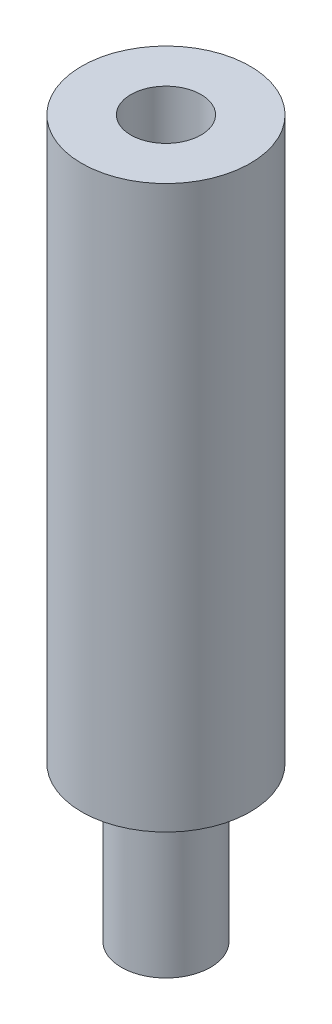
ISO-10303-21;
HEADER;
FILE_DESCRIPTION(('STEP AP214'),'2;1');
FILE_NAME('part.step','',(''),(''),'','','');
FILE_SCHEMA(('AUTOMOTIVE_DESIGN { 1 0 10303 214 1 1 1 1 }'));
ENDSEC;
DATA;
#1=APPLICATION_CONTEXT('core data for automotive mechanical design processes');
#2=APPLICATION_PROTOCOL_DEFINITION('international standard','automotive_design',2000,#1);
#3=PRODUCT_CONTEXT('',#1,'mechanical');
#4=PRODUCT('Part','Part','',(#3));
#5=PRODUCT_RELATED_PRODUCT_CATEGORY('part','',(#4));
#6=PRODUCT_DEFINITION_FORMATION('','',#4);
#7=PRODUCT_DEFINITION_CONTEXT('part definition',#1,'design');
#8=PRODUCT_DEFINITION('design','',#6,#7);
#9=PRODUCT_DEFINITION_SHAPE('','',#8);
#10=(LENGTH_UNIT() NAMED_UNIT(*) SI_UNIT(.MILLI.,.METRE.));
#11=(NAMED_UNIT(*) PLANE_ANGLE_UNIT() SI_UNIT($,.RADIAN.));
#12=(NAMED_UNIT(*) SI_UNIT($,.STERADIAN.) SOLID_ANGLE_UNIT());
#13=UNCERTAINTY_MEASURE_WITH_UNIT(LENGTH_MEASURE(1.E-05),#10,'distance_accuracy_value','');
#14=(GEOMETRIC_REPRESENTATION_CONTEXT(3) GLOBAL_UNCERTAINTY_ASSIGNED_CONTEXT((#13)) GLOBAL_UNIT_ASSIGNED_CONTEXT((#10,
#11,#12)) REPRESENTATION_CONTEXT('',''));
#15=CARTESIAN_POINT('',(0.,0.,0.));
#16=DIRECTION('',(0.,0.,1.));
#17=DIRECTION('',(1.,0.,0.));
#18=AXIS2_PLACEMENT_3D('',#15,#16,#17);
#19=CARTESIAN_POINT('',(0.,5.5,0.));
#20=DIRECTION('',(0.,-1.,0.));
#21=DIRECTION('',(0.,0.,-1.));
#22=AXIS2_PLACEMENT_3D('',#19,#20,#21);
#23=CYLINDRICAL_SURFACE('',#22,0.5);
#24=CARTESIAN_POINT('',(0.,0.,0.));
#25=DIRECTION('',(0.,1.,0.));
#26=DIRECTION('',(0.,0.,1.));
#27=AXIS2_PLACEMENT_3D('',#24,#25,#26);
#28=CIRCLE('',#27,0.5);
#29=CARTESIAN_POINT('',(0.,0.,0.5));
#30=VERTEX_POINT('',#29);
#31=EDGE_CURVE('E40',#30,#30,#28,.T.);
#32=ORIENTED_EDGE('',*,*,#31,.F.);
#33=EDGE_LOOP('',(#32));
#34=FACE_BOUND('',#33,.T.);
#35=CARTESIAN_POINT('',(0.,15.5,0.));
#36=DIRECTION('',(0.,1.,0.));
#37=DIRECTION('',(0.,0.,1.));
#38=AXIS2_PLACEMENT_3D('',#35,#36,#37);
#39=CIRCLE('',#38,0.5);
#40=CARTESIAN_POINT('',(0.,15.5,0.5));
#41=VERTEX_POINT('',#40);
#42=EDGE_CURVE('E36',#41,#41,#39,.T.);
#43=ORIENTED_EDGE('',*,*,#42,.T.);
#44=EDGE_LOOP('',(#43));
#45=FACE_BOUND('',#44,.T.);
#46=ADVANCED_FACE('F32',(#34,#45),#23,.F.);
#47=CARTESIAN_POINT('',(0.,0.,0.));
#48=DIRECTION('',(0.,1.,0.));
#49=DIRECTION('',(0.,0.,1.));
#50=AXIS2_PLACEMENT_3D('',#47,#48,#49);
#51=PLANE('',#50);
#52=CARTESIAN_POINT('',(0.,0.,0.));
#53=DIRECTION('',(0.,1.,0.));
#54=DIRECTION('',(0.,0.,1.));
#55=AXIS2_PLACEMENT_3D('',#52,#53,#54);
#56=CIRCLE('',#55,1.5875);
#57=CARTESIAN_POINT('',(0.,0.,1.5875));
#58=VERTEX_POINT('',#57);
#59=EDGE_CURVE('E10',#58,#58,#56,.T.);
#60=ORIENTED_EDGE('',*,*,#59,.F.);
#61=EDGE_LOOP('',(#60));
#62=FACE_BOUND('',#61,.T.);
#63=ORIENTED_EDGE('',*,*,#31,.T.);
#64=EDGE_LOOP('',(#63));
#65=FACE_BOUND('',#64,.T.);
#66=ADVANCED_FACE('F83',(#62,#65),#51,.F.);
#67=CARTESIAN_POINT('',(0.,5.5,0.));
#68=DIRECTION('',(0.,-1.,0.));
#69=DIRECTION('',(0.,0.,-1.));
#70=AXIS2_PLACEMENT_3D('',#67,#68,#69);
#71=CYLINDRICAL_SURFACE('',#70,1.5875);
#72=CARTESIAN_POINT('',(0.,5.25,0.));
#73=DIRECTION('',(0.,-1.,0.));
#74=DIRECTION('',(0.,0.,-1.));
#75=AXIS2_PLACEMENT_3D('',#72,#73,#74);
#76=CIRCLE('',#75,1.5875);
#77=CARTESIAN_POINT('',(0.,5.25,-1.5875));
#78=VERTEX_POINT('',#77);
#79=EDGE_CURVE('E49',#78,#78,#76,.T.);
#80=ORIENTED_EDGE('',*,*,#79,.T.);
#81=EDGE_LOOP('',(#80));
#82=FACE_BOUND('',#81,.T.);
#83=ORIENTED_EDGE('',*,*,#59,.T.);
#84=EDGE_LOOP('',(#83));
#85=FACE_BOUND('',#84,.T.);
#86=ADVANCED_FACE('F34',(#82,#85),#71,.T.);
#87=CARTESIAN_POINT('',(0.,5.5,0.));
#88=DIRECTION('',(0.,-1.,0.));
#89=DIRECTION('',(0.,0.,-1.));
#90=AXIS2_PLACEMENT_3D('',#87,#88,#89);
#91=CYLINDRICAL_SURFACE('',#90,2.);
#92=CARTESIAN_POINT('',(0.,5.5,0.));
#93=DIRECTION('',(0.,1.,0.));
#94=DIRECTION('',(0.,0.,1.));
#95=AXIS2_PLACEMENT_3D('',#92,#93,#94);
#96=CIRCLE('',#95,2.);
#97=CARTESIAN_POINT('',(0.,5.5,2.));
#98=VERTEX_POINT('',#97);
#99=EDGE_CURVE('E52',#98,#98,#96,.F.);
#100=ORIENTED_EDGE('',*,*,#99,.T.);
#101=EDGE_LOOP('',(#100));
#102=FACE_BOUND('',#101,.T.);
#103=CARTESIAN_POINT('',(0.,5.25,0.));
#104=DIRECTION('',(0.,-1.,0.));
#105=DIRECTION('',(0.,0.,-1.));
#106=AXIS2_PLACEMENT_3D('',#103,#104,#105);
#107=CIRCLE('',#106,2.);
#108=CARTESIAN_POINT('',(0.,5.25,-2.));
#109=VERTEX_POINT('',#108);
#110=EDGE_CURVE('E44',#109,#109,#107,.T.);
#111=ORIENTED_EDGE('',*,*,#110,.F.);
#112=EDGE_LOOP('',(#111));
#113=FACE_BOUND('',#112,.T.);
#114=ADVANCED_FACE('F92',(#102,#113),#91,.T.);
#115=CARTESIAN_POINT('',(0.,5.25,0.));
#116=DIRECTION('',(0.,-1.,0.));
#117=DIRECTION('',(0.,0.,-1.));
#118=AXIS2_PLACEMENT_3D('',#115,#116,#117);
#119=PLANE('',#118);
#120=ORIENTED_EDGE('',*,*,#79,.F.);
#121=EDGE_LOOP('',(#120));
#122=FACE_BOUND('',#121,.T.);
#123=ORIENTED_EDGE('',*,*,#110,.T.);
#124=EDGE_LOOP('',(#123));
#125=FACE_BOUND('',#124,.T.);
#126=ADVANCED_FACE('F95',(#122,#125),#119,.T.);
#127=CARTESIAN_POINT('',(0.,25.5,0.));
#128=DIRECTION('',(0.,1.,0.));
#129=DIRECTION('',(0.,0.,1.));
#130=AXIS2_PLACEMENT_3D('',#127,#128,#129);
#131=PLANE('',#130);
#132=CARTESIAN_POINT('',(0.,25.5,0.));
#133=DIRECTION('',(0.,1.,0.));
#134=DIRECTION('',(0.,0.,1.));
#135=AXIS2_PLACEMENT_3D('',#132,#133,#134);
#136=CIRCLE('',#135,1.25);
#137=CARTESIAN_POINT('',(0.,25.5,1.25));
#138=VERTEX_POINT('',#137);
#139=EDGE_CURVE('E61',#138,#138,#136,.T.);
#140=ORIENTED_EDGE('',*,*,#139,.F.);
#141=EDGE_LOOP('',(#140));
#142=FACE_BOUND('',#141,.T.);
#143=CARTESIAN_POINT('',(0.,25.5,0.));
#144=DIRECTION('',(0.,1.,0.));
#145=DIRECTION('',(0.,0.,1.));
#146=AXIS2_PLACEMENT_3D('',#143,#144,#145);
#147=CIRCLE('',#146,3.);
#148=CARTESIAN_POINT('',(0.,25.5,3.));
#149=VERTEX_POINT('',#148);
#150=EDGE_CURVE('E55',#149,#149,#147,.T.);
#151=ORIENTED_EDGE('',*,*,#150,.T.);
#152=EDGE_LOOP('',(#151));
#153=FACE_BOUND('',#152,.T.);
#154=ADVANCED_FACE('F99',(#142,#153),#131,.T.);
#155=CARTESIAN_POINT('',(0.,5.5,0.));
#156=DIRECTION('',(0.,1.,0.));
#157=DIRECTION('',(0.,0.,1.));
#158=AXIS2_PLACEMENT_3D('',#155,#156,#157);
#159=PLANE('',#158);
#160=ORIENTED_EDGE('',*,*,#99,.F.);
#161=EDGE_LOOP('',(#160));
#162=FACE_BOUND('',#161,.T.);
#163=CARTESIAN_POINT('',(0.,5.5,0.));
#164=DIRECTION('',(0.,1.,0.));
#165=DIRECTION('',(0.,0.,1.));
#166=AXIS2_PLACEMENT_3D('',#163,#164,#165);
#167=CIRCLE('',#166,3.);
#168=CARTESIAN_POINT('',(0.,5.5,3.));
#169=VERTEX_POINT('',#168);
#170=EDGE_CURVE('E56',#169,#169,#167,.T.);
#171=ORIENTED_EDGE('',*,*,#170,.F.);
#172=EDGE_LOOP('',(#171));
#173=FACE_BOUND('',#172,.T.);
#174=ADVANCED_FACE('F103',(#162,#173),#159,.F.);
#175=CARTESIAN_POINT('',(0.,25.5,0.));
#176=DIRECTION('',(0.,-1.,0.));
#177=DIRECTION('',(0.,0.,-1.));
#178=AXIS2_PLACEMENT_3D('',#175,#176,#177);
#179=CYLINDRICAL_SURFACE('',#178,3.);
#180=ORIENTED_EDGE('',*,*,#150,.F.);
#181=EDGE_LOOP('',(#180));
#182=FACE_BOUND('',#181,.T.);
#183=ORIENTED_EDGE('',*,*,#170,.T.);
#184=EDGE_LOOP('',(#183));
#185=FACE_BOUND('',#184,.T.);
#186=ADVANCED_FACE('F79',(#182,#185),#179,.T.);
#187=CARTESIAN_POINT('',(0.,15.5,0.));
#188=DIRECTION('',(0.,1.,0.));
#189=DIRECTION('',(0.,0.,1.));
#190=AXIS2_PLACEMENT_3D('',#187,#188,#189);
#191=CYLINDRICAL_SURFACE('',#190,1.25);
#192=CARTESIAN_POINT('',(0.,15.5,0.));
#193=DIRECTION('',(0.,1.,0.));
#194=DIRECTION('',(0.,0.,1.));
#195=AXIS2_PLACEMENT_3D('',#192,#193,#194);
#196=CIRCLE('',#195,1.25);
#197=CARTESIAN_POINT('',(0.,15.5,1.25));
#198=VERTEX_POINT('',#197);
#199=EDGE_CURVE('E64',#198,#198,#196,.T.);
#200=ORIENTED_EDGE('',*,*,#199,.F.);
#201=EDGE_LOOP('',(#200));
#202=FACE_BOUND('',#201,.T.);
#203=ORIENTED_EDGE('',*,*,#139,.T.);
#204=EDGE_LOOP('',(#203));
#205=FACE_BOUND('',#204,.T.);
#206=ADVANCED_FACE('F74',(#202,#205),#191,.F.);
#207=CARTESIAN_POINT('',(0.,15.5,0.));
#208=DIRECTION('',(0.,1.,0.));
#209=DIRECTION('',(0.,0.,1.));
#210=AXIS2_PLACEMENT_3D('',#207,#208,#209);
#211=PLANE('',#210);
#212=ORIENTED_EDGE('',*,*,#42,.F.);
#213=EDGE_LOOP('',(#212));
#214=FACE_BOUND('',#213,.T.);
#215=ORIENTED_EDGE('',*,*,#199,.T.);
#216=EDGE_LOOP('',(#215));
#217=FACE_BOUND('',#216,.T.);
#218=ADVANCED_FACE('F72',(#214,#217),#211,.T.);
#219=CLOSED_SHELL('',(#46,#66,#86,#114,#126,#154,#174,#186,#206,#218));
#220=MANIFOLD_SOLID_BREP('B2',#219);
#221=ADVANCED_BREP_SHAPE_REPRESENTATION('',(#18,#220),#14);
#222=SHAPE_DEFINITION_REPRESENTATION(#9,#221);
ENDSEC;
END-ISO-10303-21;
